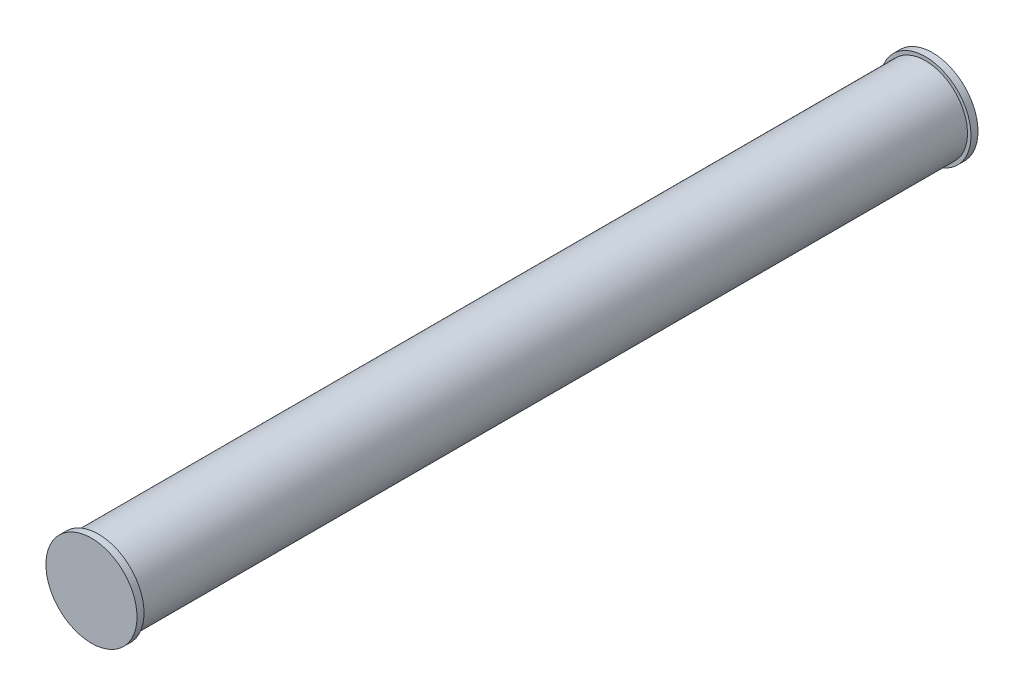
ISO-10303-21;
HEADER;
FILE_DESCRIPTION(('STEP AP214'),'2;1');
FILE_NAME('part.step','',(''),(''),'','','');
FILE_SCHEMA(('AUTOMOTIVE_DESIGN { 1 0 10303 214 1 1 1 1 }'));
ENDSEC;
DATA;
#1=APPLICATION_CONTEXT('core data for automotive mechanical design processes');
#2=APPLICATION_PROTOCOL_DEFINITION('international standard','automotive_design',2000,#1);
#3=PRODUCT_CONTEXT('',#1,'mechanical');
#4=PRODUCT('Part','Part','',(#3));
#5=PRODUCT_RELATED_PRODUCT_CATEGORY('part','',(#4));
#6=PRODUCT_DEFINITION_FORMATION('','',#4);
#7=PRODUCT_DEFINITION_CONTEXT('part definition',#1,'design');
#8=PRODUCT_DEFINITION('design','',#6,#7);
#9=PRODUCT_DEFINITION_SHAPE('','',#8);
#10=(LENGTH_UNIT() NAMED_UNIT(*) SI_UNIT(.MILLI.,.METRE.));
#11=(NAMED_UNIT(*) PLANE_ANGLE_UNIT() SI_UNIT($,.RADIAN.));
#12=(NAMED_UNIT(*) SI_UNIT($,.STERADIAN.) SOLID_ANGLE_UNIT());
#13=UNCERTAINTY_MEASURE_WITH_UNIT(LENGTH_MEASURE(1.E-05),#10,'distance_accuracy_value','');
#14=(GEOMETRIC_REPRESENTATION_CONTEXT(3) GLOBAL_UNCERTAINTY_ASSIGNED_CONTEXT((#13)) GLOBAL_UNIT_ASSIGNED_CONTEXT((#10,
#11,#12)) REPRESENTATION_CONTEXT('',''));
#15=CARTESIAN_POINT('',(0.,0.,0.));
#16=DIRECTION('',(0.,0.,1.));
#17=DIRECTION('',(1.,0.,0.));
#18=AXIS2_PLACEMENT_3D('',#15,#16,#17);
#19=CARTESIAN_POINT('',(0.,0.,152.4));
#20=DIRECTION('',(0.,0.,-1.));
#21=DIRECTION('',(-1.,0.,0.));
#22=AXIS2_PLACEMENT_3D('',#19,#20,#21);
#23=CYLINDRICAL_SURFACE('',#22,15.24);
#24=CARTESIAN_POINT('',(0.,0.,149.86));
#25=DIRECTION('',(0.,0.,1.));
#26=DIRECTION('',(1.,0.,0.));
#27=AXIS2_PLACEMENT_3D('',#24,#25,#26);
#28=CIRCLE('',#27,15.24);
#29=CARTESIAN_POINT('',(-15.24,0.,149.86));
#30=VERTEX_POINT('',#29);
#31=EDGE_CURVE('E40',#30,#30,#28,.T.);
#32=CARTESIAN_POINT('',(0.,0.,-149.86));
#33=DIRECTION('',(0.,0.,-1.));
#34=DIRECTION('',(-1.,0.,0.));
#35=AXIS2_PLACEMENT_3D('',#32,#33,#34);
#36=CIRCLE('',#35,15.24);
#37=CARTESIAN_POINT('',(-15.24,0.,-149.86));
#38=VERTEX_POINT('',#37);
#39=EDGE_CURVE('E10',#38,#38,#36,.T.);
#40=CARTESIAN_POINT('',(-15.24,0.,149.86));
#41=CARTESIAN_POINT('',(-15.24,0.,146.737916666667));
#42=CARTESIAN_POINT('',(-15.24,0.,143.615833333333));
#43=CARTESIAN_POINT('',(-15.24,0.,137.371666666667));
#44=CARTESIAN_POINT('',(-15.24,0.,134.249583333333));
#45=CARTESIAN_POINT('',(-15.24,0.,128.005416666667));
#46=CARTESIAN_POINT('',(-15.24,0.,124.883333333333));
#47=CARTESIAN_POINT('',(-15.24,0.,118.639166666667));
#48=CARTESIAN_POINT('',(-15.24,0.,115.517083333333));
#49=CARTESIAN_POINT('',(-15.24,0.,109.272916666667));
#50=CARTESIAN_POINT('',(-15.24,0.,106.150833333333));
#51=CARTESIAN_POINT('',(-15.24,0.,99.9066666666667));
#52=CARTESIAN_POINT('',(-15.24,0.,96.7845833333333));
#53=CARTESIAN_POINT('',(-15.24,0.,90.5404166666667));
#54=CARTESIAN_POINT('',(-15.24,0.,87.4183333333333));
#55=CARTESIAN_POINT('',(-15.24,0.,81.1741666666667));
#56=CARTESIAN_POINT('',(-15.24,0.,78.0520833333333));
#57=CARTESIAN_POINT('',(-15.24,0.,71.8079166666667));
#58=CARTESIAN_POINT('',(-15.24,0.,68.6858333333333));
#59=CARTESIAN_POINT('',(-15.24,0.,62.4416666666667));
#60=CARTESIAN_POINT('',(-15.24,0.,59.3195833333333));
#61=CARTESIAN_POINT('',(-15.24,0.,53.0754166666667));
#62=CARTESIAN_POINT('',(-15.24,0.,49.9533333333333));
#63=CARTESIAN_POINT('',(-15.24,0.,43.7091666666667));
#64=CARTESIAN_POINT('',(-15.24,0.,40.5870833333333));
#65=CARTESIAN_POINT('',(-15.24,0.,34.3429166666666));
#66=CARTESIAN_POINT('',(-15.24,0.,31.2208333333333));
#67=CARTESIAN_POINT('',(-15.24,0.,24.9766666666666));
#68=CARTESIAN_POINT('',(-15.24,0.,21.8545833333333));
#69=CARTESIAN_POINT('',(-15.24,0.,15.6104166666666));
#70=CARTESIAN_POINT('',(-15.24,0.,12.4883333333333));
#71=CARTESIAN_POINT('',(-15.24,0.,6.24416666666664));
#72=CARTESIAN_POINT('',(-15.24,0.,3.12208333333332));
#73=CARTESIAN_POINT('',(-15.24,0.,-3.12208333333334));
#74=CARTESIAN_POINT('',(-15.24,0.,-6.24416666666668));
#75=CARTESIAN_POINT('',(-15.24,0.,-12.4883333333334));
#76=CARTESIAN_POINT('',(-15.24,0.,-15.6104166666667));
#77=CARTESIAN_POINT('',(-15.24,0.,-21.8545833333334));
#78=CARTESIAN_POINT('',(-15.24,0.,-24.9766666666667));
#79=CARTESIAN_POINT('',(-15.24,0.,-31.2208333333333));
#80=CARTESIAN_POINT('',(-15.24,0.,-34.3429166666667));
#81=CARTESIAN_POINT('',(-15.24,0.,-40.5870833333334));
#82=CARTESIAN_POINT('',(-15.24,0.,-43.7091666666667));
#83=CARTESIAN_POINT('',(-15.24,0.,-49.9533333333334));
#84=CARTESIAN_POINT('',(-15.24,0.,-53.0754166666667));
#85=CARTESIAN_POINT('',(-15.24,0.,-59.3195833333333));
#86=CARTESIAN_POINT('',(-15.24,0.,-62.4416666666667));
#87=CARTESIAN_POINT('',(-15.24,0.,-68.6858333333334));
#88=CARTESIAN_POINT('',(-15.24,0.,-71.8079166666667));
#89=CARTESIAN_POINT('',(-15.24,0.,-78.0520833333334));
#90=CARTESIAN_POINT('',(-15.24,0.,-81.1741666666667));
#91=CARTESIAN_POINT('',(-15.24,0.,-87.4183333333334));
#92=CARTESIAN_POINT('',(-15.24,0.,-90.5404166666667));
#93=CARTESIAN_POINT('',(-15.24,0.,-96.7845833333334));
#94=CARTESIAN_POINT('',(-15.24,0.,-99.9066666666667));
#95=CARTESIAN_POINT('',(-15.24,0.,-106.150833333333));
#96=CARTESIAN_POINT('',(-15.24,0.,-109.272916666667));
#97=CARTESIAN_POINT('',(-15.24,0.,-115.517083333333));
#98=CARTESIAN_POINT('',(-15.24,0.,-118.639166666667));
#99=CARTESIAN_POINT('',(-15.24,0.,-124.883333333333));
#100=CARTESIAN_POINT('',(-15.24,0.,-128.005416666667));
#101=CARTESIAN_POINT('',(-15.24,0.,-134.249583333333));
#102=CARTESIAN_POINT('',(-15.24,0.,-137.371666666667));
#103=CARTESIAN_POINT('',(-15.24,0.,-143.615833333333));
#104=CARTESIAN_POINT('',(-15.24,0.,-146.737916666667));
#105=CARTESIAN_POINT('',(-15.24,0.,-149.86));
#106=B_SPLINE_CURVE_WITH_KNOTS('',3,(#40,#41,#42,#43,#44,#45,#46,#47,#48,#49,#50,#51,#52,#53,
#54,#55,#56,#57,#58,#59,#60,#61,#62,#63,#64,#65,#66,#67,#68,#69,#70,#71,#72,#73,#74,#75,#76,#77,
#78,#79,#80,#81,#82,#83,#84,#85,#86,#87,#88,#89,#90,#91,#92,#93,#94,#95,#96,#97,#98,#99,#100,
#101,#102,#103,#104,#105),.UNSPECIFIED.,.F.,.F.,(4,2,2,2,2,2,2,2,2,2,2,2,2,2,2,2,2,2,2,2,2,2,2,
2,2,2,2,2,2,2,2,2,4),(0.,9.36625000000002,18.7325,28.09875,37.465,46.83125,56.1975,65.56375,
74.93,84.29625,93.6625,103.02875,112.395,121.76125,131.1275,140.49375,149.86,159.22625,168.5925,
177.95875,187.325,196.69125,206.0575,215.42375,224.79,234.15625,243.5225,252.88875,262.255,
271.62125,280.9875,290.35375,299.72),.UNSPECIFIED.);
#107=EDGE_CURVE('BSEAM34',#30,#38,#106,.T.);
#108=ORIENTED_EDGE('',*,*,#31,.F.);
#109=ORIENTED_EDGE('',*,*,#39,.F.);
#110=ORIENTED_EDGE('',*,*,#107,.T.);
#111=ORIENTED_EDGE('',*,*,#107,.F.);
#112=EDGE_LOOP('',(#108,#110,#109,#111));
#113=FACE_BOUND('',#112,.T.);
#114=ADVANCED_FACE('F34',(#113),#23,.T.);
#115=CARTESIAN_POINT('',(0.,0.,149.86));
#116=DIRECTION('',(0.,0.,1.));
#117=DIRECTION('',(1.,0.,0.));
#118=AXIS2_PLACEMENT_3D('',#115,#116,#117);
#119=CYLINDRICAL_SURFACE('',#118,16.51);
#120=CARTESIAN_POINT('',(0.,0.,149.86));
#121=DIRECTION('',(0.,0.,1.));
#122=DIRECTION('',(1.,0.,0.));
#123=AXIS2_PLACEMENT_3D('',#120,#121,#122);
#124=CIRCLE('',#123,16.51);
#125=CARTESIAN_POINT('',(16.51,0.,149.86));
#126=VERTEX_POINT('',#125);
#127=EDGE_CURVE('E44',#126,#126,#124,.T.);
#128=ORIENTED_EDGE('',*,*,#127,.T.);
#129=EDGE_LOOP('',(#128));
#130=FACE_BOUND('',#129,.T.);
#131=CARTESIAN_POINT('',(0.,0.,152.4));
#132=DIRECTION('',(0.,0.,1.));
#133=DIRECTION('',(1.,0.,0.));
#134=AXIS2_PLACEMENT_3D('',#131,#132,#133);
#135=CIRCLE('',#134,16.51);
#136=CARTESIAN_POINT('',(16.51,0.,152.4));
#137=VERTEX_POINT('',#136);
#138=EDGE_CURVE('E48',#137,#137,#135,.T.);
#139=ORIENTED_EDGE('',*,*,#138,.F.);
#140=EDGE_LOOP('',(#139));
#141=FACE_BOUND('',#140,.T.);
#142=ADVANCED_FACE('F77',(#130,#141),#119,.T.);
#143=CARTESIAN_POINT('',(0.,0.,149.86));
#144=DIRECTION('',(0.,0.,1.));
#145=DIRECTION('',(1.,0.,0.));
#146=AXIS2_PLACEMENT_3D('',#143,#144,#145);
#147=PLANE('',#146);
#148=ORIENTED_EDGE('',*,*,#31,.T.);
#149=EDGE_LOOP('',(#148));
#150=FACE_BOUND('',#149,.T.);
#151=ORIENTED_EDGE('',*,*,#127,.F.);
#152=EDGE_LOOP('',(#151));
#153=FACE_BOUND('',#152,.T.);
#154=ADVANCED_FACE('F82',(#150,#153),#147,.F.);
#155=CARTESIAN_POINT('',(0.,0.,152.4));
#156=DIRECTION('',(0.,0.,1.));
#157=DIRECTION('',(1.,0.,0.));
#158=AXIS2_PLACEMENT_3D('',#155,#156,#157);
#159=PLANE('',#158);
#160=ORIENTED_EDGE('',*,*,#138,.T.);
#161=EDGE_LOOP('',(#160));
#162=FACE_BOUND('',#161,.T.);
#163=ADVANCED_FACE('F65',(#162),#159,.T.);
#164=CARTESIAN_POINT('',(0.,0.,-149.86));
#165=DIRECTION('',(0.,0.,-1.));
#166=DIRECTION('',(-1.,0.,0.));
#167=AXIS2_PLACEMENT_3D('',#164,#165,#166);
#168=CYLINDRICAL_SURFACE('',#167,16.51);
#169=CARTESIAN_POINT('',(0.,0.,-149.86));
#170=DIRECTION('',(0.,0.,1.));
#171=DIRECTION('',(1.,0.,0.));
#172=AXIS2_PLACEMENT_3D('',#169,#170,#171);
#173=CIRCLE('',#172,16.51);
#174=CARTESIAN_POINT('',(16.51,0.,-149.86));
#175=VERTEX_POINT('',#174);
#176=EDGE_CURVE('E52',#175,#175,#173,.T.);
#177=ORIENTED_EDGE('',*,*,#176,.F.);
#178=EDGE_LOOP('',(#177));
#179=FACE_BOUND('',#178,.T.);
#180=CARTESIAN_POINT('',(0.,0.,-152.4));
#181=DIRECTION('',(0.,0.,1.));
#182=DIRECTION('',(1.,0.,0.));
#183=AXIS2_PLACEMENT_3D('',#180,#181,#182);
#184=CIRCLE('',#183,16.51);
#185=CARTESIAN_POINT('',(16.51,0.,-152.4));
#186=VERTEX_POINT('',#185);
#187=EDGE_CURVE('E54',#186,#186,#184,.T.);
#188=ORIENTED_EDGE('',*,*,#187,.T.);
#189=EDGE_LOOP('',(#188));
#190=FACE_BOUND('',#189,.T.);
#191=ADVANCED_FACE('F62',(#179,#190),#168,.T.);
#192=CARTESIAN_POINT('',(0.,0.,-149.86));
#193=DIRECTION('',(0.,0.,-1.));
#194=DIRECTION('',(1.,0.,0.));
#195=AXIS2_PLACEMENT_3D('',#192,#193,#194);
#196=PLANE('',#195);
#197=ORIENTED_EDGE('',*,*,#39,.T.);
#198=EDGE_LOOP('',(#197));
#199=FACE_BOUND('',#198,.T.);
#200=ORIENTED_EDGE('',*,*,#176,.T.);
#201=EDGE_LOOP('',(#200));
#202=FACE_BOUND('',#201,.T.);
#203=ADVANCED_FACE('F60',(#199,#202),#196,.F.);
#204=CARTESIAN_POINT('',(0.,0.,-152.4));
#205=DIRECTION('',(0.,0.,1.));
#206=DIRECTION('',(1.,0.,0.));
#207=AXIS2_PLACEMENT_3D('',#204,#205,#206);
#208=PLANE('',#207);
#209=ORIENTED_EDGE('',*,*,#187,.F.);
#210=EDGE_LOOP('',(#209));
#211=FACE_BOUND('',#210,.T.);
#212=ADVANCED_FACE('F69',(#211),#208,.F.);
#213=CLOSED_SHELL('',(#114,#142,#154,#163,#191,#203,#212));
#214=MANIFOLD_SOLID_BREP('B2',#213);
#215=ADVANCED_BREP_SHAPE_REPRESENTATION('',(#18,#214),#14);
#216=SHAPE_DEFINITION_REPRESENTATION(#9,#215);
ENDSEC;
END-ISO-10303-21;
